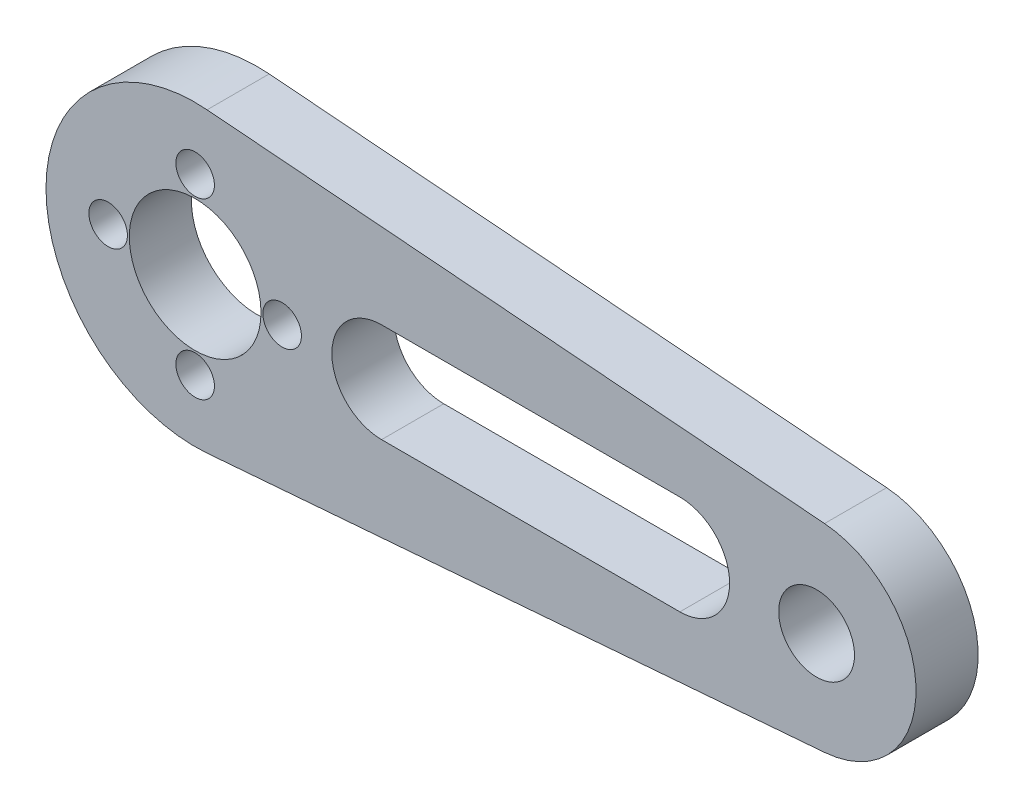
ISO-10303-21;
HEADER;
FILE_DESCRIPTION(('STEP AP214'),'2;1');
FILE_NAME('part.step','',(''),(''),'','','');
FILE_SCHEMA(('AUTOMOTIVE_DESIGN { 1 0 10303 214 1 1 1 1 }'));
ENDSEC;
DATA;
#1=APPLICATION_CONTEXT('core data for automotive mechanical design processes');
#2=APPLICATION_PROTOCOL_DEFINITION('international standard','automotive_design',2000,#1);
#3=PRODUCT_CONTEXT('',#1,'mechanical');
#4=PRODUCT('Part','Part','',(#3));
#5=PRODUCT_RELATED_PRODUCT_CATEGORY('part','',(#4));
#6=PRODUCT_DEFINITION_FORMATION('','',#4);
#7=PRODUCT_DEFINITION_CONTEXT('part definition',#1,'design');
#8=PRODUCT_DEFINITION('design','',#6,#7);
#9=PRODUCT_DEFINITION_SHAPE('','',#8);
#10=(LENGTH_UNIT() NAMED_UNIT(*) SI_UNIT(.MILLI.,.METRE.));
#11=(NAMED_UNIT(*) PLANE_ANGLE_UNIT() SI_UNIT($,.RADIAN.));
#12=(NAMED_UNIT(*) SI_UNIT($,.STERADIAN.) SOLID_ANGLE_UNIT());
#13=UNCERTAINTY_MEASURE_WITH_UNIT(LENGTH_MEASURE(1.E-05),#10,'distance_accuracy_value','');
#14=(GEOMETRIC_REPRESENTATION_CONTEXT(3) GLOBAL_UNCERTAINTY_ASSIGNED_CONTEXT((#13)) GLOBAL_UNIT_ASSIGNED_CONTEXT((#10,
#11,#12)) REPRESENTATION_CONTEXT('',''));
#15=CARTESIAN_POINT('',(0.,0.,0.));
#16=DIRECTION('',(0.,0.,1.));
#17=DIRECTION('',(1.,0.,0.));
#18=AXIS2_PLACEMENT_3D('',#15,#16,#17);
#19=CARTESIAN_POINT('',(0.,0.,5.));
#20=DIRECTION('',(0.,0.,1.));
#21=DIRECTION('',(1.,0.,0.));
#22=AXIS2_PLACEMENT_3D('',#19,#20,#21);
#23=PLANE('',#22);
#24=CARTESIAN_POINT('',(15.,0.,5.));
#25=DIRECTION('',(0.,0.,1.));
#26=DIRECTION('',(1.,0.,0.));
#27=AXIS2_PLACEMENT_3D('',#24,#25,#26);
#28=CIRCLE('',#27,4.);
#29=CARTESIAN_POINT('',(15.,4.,5.));
#30=VERTEX_POINT('',#29);
#31=CARTESIAN_POINT('',(15.,-4.,5.));
#32=VERTEX_POINT('',#31);
#33=EDGE_CURVE('E49',#30,#32,#28,.T.);
#34=ORIENTED_EDGE('',*,*,#33,.F.);
#35=DIRECTION('',(-1.,0.,0.));
#36=VECTOR('',#35,1.);
#37=CARTESIAN_POINT('',(15.,4.,5.));
#38=LINE('',#37,#36);
#39=CARTESIAN_POINT('',(39.,4.,5.));
#40=VERTEX_POINT('',#39);
#41=EDGE_CURVE('E117',#40,#30,#38,.T.);
#42=ORIENTED_EDGE('',*,*,#41,.F.);
#43=CARTESIAN_POINT('',(39.,0.,5.));
#44=DIRECTION('',(0.,0.,1.));
#45=DIRECTION('',(1.,0.,0.));
#46=AXIS2_PLACEMENT_3D('',#43,#44,#45);
#47=CIRCLE('',#46,4.);
#48=CARTESIAN_POINT('',(39.,-4.,5.));
#49=VERTEX_POINT('',#48);
#50=EDGE_CURVE('E102',#49,#40,#47,.T.);
#51=ORIENTED_EDGE('',*,*,#50,.F.);
#52=DIRECTION('',(1.,0.,0.));
#53=VECTOR('',#52,1.);
#54=CARTESIAN_POINT('',(15.,-4.,5.));
#55=LINE('',#54,#53);
#56=EDGE_CURVE('E111',#32,#49,#55,.T.);
#57=ORIENTED_EDGE('',*,*,#56,.F.);
#58=EDGE_LOOP('',(#34,#42,#51,#57));
#59=FACE_BOUND('',#58,.T.);
#60=CARTESIAN_POINT('',(0.,7.,5.));
#61=DIRECTION('',(0.,0.,1.));
#62=DIRECTION('',(1.,0.,0.));
#63=AXIS2_PLACEMENT_3D('',#60,#61,#62);
#64=CIRCLE('',#63,1.55);
#65=CARTESIAN_POINT('',(1.55,7.,5.));
#66=VERTEX_POINT('',#65);
#67=EDGE_CURVE('E133',#66,#66,#64,.T.);
#68=ORIENTED_EDGE('',*,*,#67,.F.);
#69=EDGE_LOOP('',(#68));
#70=FACE_BOUND('',#69,.T.);
#71=CARTESIAN_POINT('',(7.,0.,5.));
#72=DIRECTION('',(0.,0.,1.));
#73=DIRECTION('',(1.,0.,0.));
#74=AXIS2_PLACEMENT_3D('',#71,#72,#73);
#75=CIRCLE('',#74,1.55);
#76=CARTESIAN_POINT('',(8.55,0.,5.));
#77=VERTEX_POINT('',#76);
#78=EDGE_CURVE('E145',#77,#77,#75,.T.);
#79=ORIENTED_EDGE('',*,*,#78,.F.);
#80=EDGE_LOOP('',(#79));
#81=FACE_BOUND('',#80,.T.);
#82=CARTESIAN_POINT('',(0.,0.,5.));
#83=DIRECTION('',(0.,0.,1.));
#84=DIRECTION('',(1.,0.,0.));
#85=AXIS2_PLACEMENT_3D('',#82,#83,#84);
#86=CIRCLE('',#85,5.3);
#87=CARTESIAN_POINT('',(5.3,0.,5.));
#88=VERTEX_POINT('',#87);
#89=EDGE_CURVE('E157',#88,#88,#86,.T.);
#90=ORIENTED_EDGE('',*,*,#89,.F.);
#91=EDGE_LOOP('',(#90));
#92=FACE_BOUND('',#91,.T.);
#93=CARTESIAN_POINT('',(0.,0.,5.));
#94=DIRECTION('',(0.,0.,1.));
#95=DIRECTION('',(1.,0.,0.));
#96=AXIS2_PLACEMENT_3D('',#93,#94,#95);
#97=CIRCLE('',#96,12.);
#98=CARTESIAN_POINT('',(0.959999999999999,11.961538362602,5.));
#99=VERTEX_POINT('',#98);
#100=CARTESIAN_POINT('',(0.96,-11.961538362602,5.));
#101=VERTEX_POINT('',#100);
#102=EDGE_CURVE('E163',#99,#101,#97,.T.);
#103=ORIENTED_EDGE('',*,*,#102,.T.);
#104=DIRECTION('',(0.996794863550169,0.0800000000000001,0.));
#105=VECTOR('',#104,1.);
#106=CARTESIAN_POINT('',(50.64,-7.97435890840135,5.));
#107=LINE('',#106,#105);
#108=CARTESIAN_POINT('',(50.64,-7.97435890840135,5.));
#109=VERTEX_POINT('',#108);
#110=EDGE_CURVE('E166',#101,#109,#107,.T.);
#111=ORIENTED_EDGE('',*,*,#110,.T.);
#112=CARTESIAN_POINT('',(50.,0.,5.));
#113=DIRECTION('',(0.,0.,1.));
#114=DIRECTION('',(1.,0.,0.));
#115=AXIS2_PLACEMENT_3D('',#112,#113,#114);
#116=CIRCLE('',#115,8.);
#117=CARTESIAN_POINT('',(50.64,7.97435890840135,5.));
#118=VERTEX_POINT('',#117);
#119=EDGE_CURVE('E169',#109,#118,#116,.T.);
#120=ORIENTED_EDGE('',*,*,#119,.T.);
#121=DIRECTION('',(-0.996794863550169,0.0799999999999999,0.));
#122=VECTOR('',#121,1.);
#123=CARTESIAN_POINT('',(0.959999999999999,11.961538362602,5.));
#124=LINE('',#123,#122);
#125=EDGE_CURVE('E171',#118,#99,#124,.T.);
#126=ORIENTED_EDGE('',*,*,#125,.T.);
#127=EDGE_LOOP('',(#103,#111,#120,#126));
#128=FACE_BOUND('',#127,.T.);
#129=CARTESIAN_POINT('',(50.,0.,5.));
#130=DIRECTION('',(0.,0.,1.));
#131=DIRECTION('',(1.,0.,0.));
#132=AXIS2_PLACEMENT_3D('',#129,#130,#131);
#133=CIRCLE('',#132,3.05);
#134=CARTESIAN_POINT('',(53.05,0.,5.));
#135=VERTEX_POINT('',#134);
#136=EDGE_CURVE('E151',#135,#135,#133,.T.);
#137=ORIENTED_EDGE('',*,*,#136,.F.);
#138=EDGE_LOOP('',(#137));
#139=FACE_BOUND('',#138,.T.);
#140=CARTESIAN_POINT('',(-7.,0.,5.));
#141=DIRECTION('',(0.,0.,1.));
#142=DIRECTION('',(1.,0.,0.));
#143=AXIS2_PLACEMENT_3D('',#140,#141,#142);
#144=CIRCLE('',#143,1.55);
#145=CARTESIAN_POINT('',(-5.45,0.,5.));
#146=VERTEX_POINT('',#145);
#147=EDGE_CURVE('E139',#146,#146,#144,.T.);
#148=ORIENTED_EDGE('',*,*,#147,.F.);
#149=EDGE_LOOP('',(#148));
#150=FACE_BOUND('',#149,.T.);
#151=CARTESIAN_POINT('',(0.,-7.,5.));
#152=DIRECTION('',(0.,0.,1.));
#153=DIRECTION('',(1.,0.,0.));
#154=AXIS2_PLACEMENT_3D('',#151,#152,#153);
#155=CIRCLE('',#154,1.55);
#156=CARTESIAN_POINT('',(1.55,-7.,5.));
#157=VERTEX_POINT('',#156);
#158=EDGE_CURVE('E127',#157,#157,#155,.T.);
#159=ORIENTED_EDGE('',*,*,#158,.F.);
#160=EDGE_LOOP('',(#159));
#161=FACE_BOUND('',#160,.T.);
#162=ADVANCED_FACE('F34',(#59,#70,#81,#92,#128,#139,#150,#161),#23,.T.);
#163=CARTESIAN_POINT('',(0.,0.,0.));
#164=DIRECTION('',(0.,0.,1.));
#165=DIRECTION('',(1.,0.,0.));
#166=AXIS2_PLACEMENT_3D('',#163,#164,#165);
#167=PLANE('',#166);
#168=DIRECTION('',(-1.,0.,0.));
#169=VECTOR('',#168,1.);
#170=CARTESIAN_POINT('',(0.,4.,0.));
#171=LINE('',#170,#169);
#172=CARTESIAN_POINT('',(39.,4.,0.));
#173=VERTEX_POINT('',#172);
#174=CARTESIAN_POINT('',(15.,4.,0.));
#175=VERTEX_POINT('',#174);
#176=EDGE_CURVE('E42',#173,#175,#171,.T.);
#177=ORIENTED_EDGE('',*,*,#176,.T.);
#178=CARTESIAN_POINT('',(15.,0.,0.));
#179=DIRECTION('',(0.,0.,1.));
#180=DIRECTION('',(1.,0.,0.));
#181=AXIS2_PLACEMENT_3D('',#178,#179,#180);
#182=CIRCLE('',#181,4.);
#183=CARTESIAN_POINT('',(15.,-4.,0.));
#184=VERTEX_POINT('',#183);
#185=EDGE_CURVE('E11',#175,#184,#182,.T.);
#186=ORIENTED_EDGE('',*,*,#185,.T.);
#187=DIRECTION('',(1.,0.,0.));
#188=VECTOR('',#187,1.);
#189=CARTESIAN_POINT('',(0.,-4.,0.));
#190=LINE('',#189,#188);
#191=CARTESIAN_POINT('',(39.,-4.,0.));
#192=VERTEX_POINT('',#191);
#193=EDGE_CURVE('E192',#184,#192,#190,.T.);
#194=ORIENTED_EDGE('',*,*,#193,.T.);
#195=CARTESIAN_POINT('',(39.,0.,0.));
#196=DIRECTION('',(0.,0.,1.));
#197=DIRECTION('',(1.,0.,0.));
#198=AXIS2_PLACEMENT_3D('',#195,#196,#197);
#199=CIRCLE('',#198,4.);
#200=EDGE_CURVE('E105',#192,#173,#199,.T.);
#201=ORIENTED_EDGE('',*,*,#200,.T.);
#202=EDGE_LOOP('',(#177,#186,#194,#201));
#203=FACE_BOUND('',#202,.T.);
#204=CARTESIAN_POINT('',(0.,0.,0.));
#205=DIRECTION('',(0.,0.,1.));
#206=DIRECTION('',(1.,0.,0.));
#207=AXIS2_PLACEMENT_3D('',#204,#205,#206);
#208=CIRCLE('',#207,12.);
#209=CARTESIAN_POINT('',(0.959999999999999,11.961538362602,0.));
#210=VERTEX_POINT('',#209);
#211=CARTESIAN_POINT('',(0.96,-11.961538362602,0.));
#212=VERTEX_POINT('',#211);
#213=EDGE_CURVE('E160',#210,#212,#208,.T.);
#214=ORIENTED_EDGE('',*,*,#213,.F.);
#215=DIRECTION('',(-0.996794863550169,0.0799999999999999,0.));
#216=VECTOR('',#215,1.);
#217=CARTESIAN_POINT('',(0.959999999999999,11.961538362602,0.));
#218=LINE('',#217,#216);
#219=CARTESIAN_POINT('',(50.64,7.97435890840135,0.));
#220=VERTEX_POINT('',#219);
#221=EDGE_CURVE('E167',#220,#210,#218,.T.);
#222=ORIENTED_EDGE('',*,*,#221,.F.);
#223=CARTESIAN_POINT('',(50.,0.,0.));
#224=DIRECTION('',(0.,0.,1.));
#225=DIRECTION('',(1.,0.,0.));
#226=AXIS2_PLACEMENT_3D('',#223,#224,#225);
#227=CIRCLE('',#226,8.);
#228=CARTESIAN_POINT('',(50.64,-7.97435890840135,0.));
#229=VERTEX_POINT('',#228);
#230=EDGE_CURVE('E178',#229,#220,#227,.T.);
#231=ORIENTED_EDGE('',*,*,#230,.F.);
#232=DIRECTION('',(0.996794863550169,0.0800000000000001,0.));
#233=VECTOR('',#232,1.);
#234=CARTESIAN_POINT('',(50.64,-7.97435890840135,0.));
#235=LINE('',#234,#233);
#236=EDGE_CURVE('E176',#212,#229,#235,.T.);
#237=ORIENTED_EDGE('',*,*,#236,.F.);
#238=EDGE_LOOP('',(#214,#222,#231,#237));
#239=FACE_BOUND('',#238,.T.);
#240=CARTESIAN_POINT('',(0.,0.,0.));
#241=DIRECTION('',(0.,0.,1.));
#242=DIRECTION('',(1.,0.,0.));
#243=AXIS2_PLACEMENT_3D('',#240,#241,#242);
#244=CIRCLE('',#243,5.3);
#245=CARTESIAN_POINT('',(5.3,0.,0.));
#246=VERTEX_POINT('',#245);
#247=EDGE_CURVE('E154',#246,#246,#244,.T.);
#248=ORIENTED_EDGE('',*,*,#247,.T.);
#249=EDGE_LOOP('',(#248));
#250=FACE_BOUND('',#249,.T.);
#251=CARTESIAN_POINT('',(50.,0.,0.));
#252=DIRECTION('',(0.,0.,1.));
#253=DIRECTION('',(1.,0.,0.));
#254=AXIS2_PLACEMENT_3D('',#251,#252,#253);
#255=CIRCLE('',#254,3.05);
#256=CARTESIAN_POINT('',(53.05,0.,0.));
#257=VERTEX_POINT('',#256);
#258=EDGE_CURVE('E148',#257,#257,#255,.T.);
#259=ORIENTED_EDGE('',*,*,#258,.T.);
#260=EDGE_LOOP('',(#259));
#261=FACE_BOUND('',#260,.T.);
#262=CARTESIAN_POINT('',(7.,0.,0.));
#263=DIRECTION('',(0.,0.,1.));
#264=DIRECTION('',(1.,0.,0.));
#265=AXIS2_PLACEMENT_3D('',#262,#263,#264);
#266=CIRCLE('',#265,1.55);
#267=CARTESIAN_POINT('',(8.55,0.,0.));
#268=VERTEX_POINT('',#267);
#269=EDGE_CURVE('E142',#268,#268,#266,.T.);
#270=ORIENTED_EDGE('',*,*,#269,.T.);
#271=EDGE_LOOP('',(#270));
#272=FACE_BOUND('',#271,.T.);
#273=CARTESIAN_POINT('',(-7.,0.,0.));
#274=DIRECTION('',(0.,0.,1.));
#275=DIRECTION('',(1.,0.,0.));
#276=AXIS2_PLACEMENT_3D('',#273,#274,#275);
#277=CIRCLE('',#276,1.55);
#278=CARTESIAN_POINT('',(-5.45,0.,0.));
#279=VERTEX_POINT('',#278);
#280=EDGE_CURVE('E136',#279,#279,#277,.T.);
#281=ORIENTED_EDGE('',*,*,#280,.T.);
#282=EDGE_LOOP('',(#281));
#283=FACE_BOUND('',#282,.T.);
#284=CARTESIAN_POINT('',(0.,7.,0.));
#285=DIRECTION('',(0.,0.,1.));
#286=DIRECTION('',(1.,0.,0.));
#287=AXIS2_PLACEMENT_3D('',#284,#285,#286);
#288=CIRCLE('',#287,1.55);
#289=CARTESIAN_POINT('',(1.55,7.,0.));
#290=VERTEX_POINT('',#289);
#291=EDGE_CURVE('E130',#290,#290,#288,.T.);
#292=ORIENTED_EDGE('',*,*,#291,.T.);
#293=EDGE_LOOP('',(#292));
#294=FACE_BOUND('',#293,.T.);
#295=CARTESIAN_POINT('',(0.,-7.,0.));
#296=DIRECTION('',(0.,0.,1.));
#297=DIRECTION('',(1.,0.,0.));
#298=AXIS2_PLACEMENT_3D('',#295,#296,#297);
#299=CIRCLE('',#298,1.55);
#300=CARTESIAN_POINT('',(1.55,-7.,0.));
#301=VERTEX_POINT('',#300);
#302=EDGE_CURVE('E124',#301,#301,#299,.T.);
#303=ORIENTED_EDGE('',*,*,#302,.T.);
#304=EDGE_LOOP('',(#303));
#305=FACE_BOUND('',#304,.T.);
#306=ADVANCED_FACE('F196',(#203,#239,#250,#261,#272,#283,#294,#305),#167,.F.);
#307=CARTESIAN_POINT('',(0.,0.,5.));
#308=DIRECTION('',(0.,0.,-1.));
#309=DIRECTION('',(-1.,0.,0.));
#310=AXIS2_PLACEMENT_3D('',#307,#308,#309);
#311=CYLINDRICAL_SURFACE('',#310,12.);
#312=ORIENTED_EDGE('',*,*,#213,.T.);
#313=DIRECTION('',(0.,0.,-1.));
#314=VECTOR('',#313,1.);
#315=CARTESIAN_POINT('',(0.96,-11.961538362602,5.));
#316=LINE('',#315,#314);
#317=EDGE_CURVE('E189',#101,#212,#316,.T.);
#318=ORIENTED_EDGE('',*,*,#317,.F.);
#319=ORIENTED_EDGE('',*,*,#102,.F.);
#320=DIRECTION('',(0.,0.,-1.));
#321=VECTOR('',#320,1.);
#322=CARTESIAN_POINT('',(0.959999999999999,11.961538362602,5.));
#323=LINE('',#322,#321);
#324=EDGE_CURVE('E173',#99,#210,#323,.T.);
#325=ORIENTED_EDGE('',*,*,#324,.T.);
#326=EDGE_LOOP('',(#312,#318,#319,#325));
#327=FACE_BOUND('',#326,.T.);
#328=ADVANCED_FACE('F36',(#327),#311,.T.);
#329=CARTESIAN_POINT('',(50.64,-7.97435890840135,5.));
#330=DIRECTION('',(-0.0800000000000001,0.996794863550169,0.));
#331=DIRECTION('',(-0.996794863550169,-0.0800000000000001,0.));
#332=AXIS2_PLACEMENT_3D('',#329,#330,#331);
#333=PLANE('',#332);
#334=ORIENTED_EDGE('',*,*,#236,.T.);
#335=DIRECTION('',(0.,0.,-1.));
#336=VECTOR('',#335,1.);
#337=CARTESIAN_POINT('',(50.64,-7.97435890840135,5.));
#338=LINE('',#337,#336);
#339=EDGE_CURVE('E186',#109,#229,#338,.T.);
#340=ORIENTED_EDGE('',*,*,#339,.F.);
#341=ORIENTED_EDGE('',*,*,#110,.F.);
#342=ORIENTED_EDGE('',*,*,#317,.T.);
#343=EDGE_LOOP('',(#334,#340,#341,#342));
#344=FACE_BOUND('',#343,.T.);
#345=ADVANCED_FACE('F230',(#344),#333,.F.);
#346=CARTESIAN_POINT('',(50.,0.,5.));
#347=DIRECTION('',(0.,0.,-1.));
#348=DIRECTION('',(-1.,0.,0.));
#349=AXIS2_PLACEMENT_3D('',#346,#347,#348);
#350=CYLINDRICAL_SURFACE('',#349,8.);
#351=ORIENTED_EDGE('',*,*,#230,.T.);
#352=DIRECTION('',(0.,0.,-1.));
#353=VECTOR('',#352,1.);
#354=CARTESIAN_POINT('',(50.64,7.97435890840135,5.));
#355=LINE('',#354,#353);
#356=EDGE_CURVE('E183',#118,#220,#355,.T.);
#357=ORIENTED_EDGE('',*,*,#356,.F.);
#358=ORIENTED_EDGE('',*,*,#119,.F.);
#359=ORIENTED_EDGE('',*,*,#339,.T.);
#360=EDGE_LOOP('',(#351,#357,#358,#359));
#361=FACE_BOUND('',#360,.T.);
#362=ADVANCED_FACE('F227',(#361),#350,.T.);
#363=CARTESIAN_POINT('',(0.959999999999999,11.961538362602,5.));
#364=DIRECTION('',(-0.0799999999999999,-0.996794863550169,0.));
#365=DIRECTION('',(0.996794863550169,-0.0799999999999999,0.));
#366=AXIS2_PLACEMENT_3D('',#363,#364,#365);
#367=PLANE('',#366);
#368=ORIENTED_EDGE('',*,*,#221,.T.);
#369=ORIENTED_EDGE('',*,*,#324,.F.);
#370=ORIENTED_EDGE('',*,*,#125,.F.);
#371=ORIENTED_EDGE('',*,*,#356,.T.);
#372=EDGE_LOOP('',(#368,#369,#370,#371));
#373=FACE_BOUND('',#372,.T.);
#374=ADVANCED_FACE('F224',(#373),#367,.F.);
#375=CARTESIAN_POINT('',(0.,0.,5.));
#376=DIRECTION('',(0.,0.,-1.));
#377=DIRECTION('',(-1.,0.,0.));
#378=AXIS2_PLACEMENT_3D('',#375,#376,#377);
#379=CYLINDRICAL_SURFACE('',#378,5.3);
#380=ORIENTED_EDGE('',*,*,#89,.T.);
#381=EDGE_LOOP('',(#380));
#382=FACE_BOUND('',#381,.T.);
#383=ORIENTED_EDGE('',*,*,#247,.F.);
#384=EDGE_LOOP('',(#383));
#385=FACE_BOUND('',#384,.T.);
#386=ADVANCED_FACE('F221',(#382,#385),#379,.F.);
#387=CARTESIAN_POINT('',(50.,0.,5.));
#388=DIRECTION('',(0.,0.,-1.));
#389=DIRECTION('',(-1.,0.,0.));
#390=AXIS2_PLACEMENT_3D('',#387,#388,#389);
#391=CYLINDRICAL_SURFACE('',#390,3.05);
#392=ORIENTED_EDGE('',*,*,#136,.T.);
#393=EDGE_LOOP('',(#392));
#394=FACE_BOUND('',#393,.T.);
#395=ORIENTED_EDGE('',*,*,#258,.F.);
#396=EDGE_LOOP('',(#395));
#397=FACE_BOUND('',#396,.T.);
#398=ADVANCED_FACE('F277',(#394,#397),#391,.F.);
#399=CARTESIAN_POINT('',(7.,0.,5.));
#400=DIRECTION('',(0.,0.,-1.));
#401=DIRECTION('',(-1.,0.,0.));
#402=AXIS2_PLACEMENT_3D('',#399,#400,#401);
#403=CYLINDRICAL_SURFACE('',#402,1.55);
#404=ORIENTED_EDGE('',*,*,#78,.T.);
#405=EDGE_LOOP('',(#404));
#406=FACE_BOUND('',#405,.T.);
#407=ORIENTED_EDGE('',*,*,#269,.F.);
#408=EDGE_LOOP('',(#407));
#409=FACE_BOUND('',#408,.T.);
#410=ADVANCED_FACE('F263',(#406,#409),#403,.F.);
#411=CARTESIAN_POINT('',(-7.,0.,5.));
#412=DIRECTION('',(0.,0.,-1.));
#413=DIRECTION('',(-1.,0.,0.));
#414=AXIS2_PLACEMENT_3D('',#411,#412,#413);
#415=CYLINDRICAL_SURFACE('',#414,1.55);
#416=ORIENTED_EDGE('',*,*,#147,.T.);
#417=EDGE_LOOP('',(#416));
#418=FACE_BOUND('',#417,.T.);
#419=ORIENTED_EDGE('',*,*,#280,.F.);
#420=EDGE_LOOP('',(#419));
#421=FACE_BOUND('',#420,.T.);
#422=ADVANCED_FACE('F260',(#418,#421),#415,.F.);
#423=CARTESIAN_POINT('',(0.,7.,5.));
#424=DIRECTION('',(0.,0.,-1.));
#425=DIRECTION('',(-1.,0.,0.));
#426=AXIS2_PLACEMENT_3D('',#423,#424,#425);
#427=CYLINDRICAL_SURFACE('',#426,1.55);
#428=ORIENTED_EDGE('',*,*,#67,.T.);
#429=EDGE_LOOP('',(#428));
#430=FACE_BOUND('',#429,.T.);
#431=ORIENTED_EDGE('',*,*,#291,.F.);
#432=EDGE_LOOP('',(#431));
#433=FACE_BOUND('',#432,.T.);
#434=ADVANCED_FACE('F210',(#430,#433),#427,.F.);
#435=CARTESIAN_POINT('',(0.,-7.,5.));
#436=DIRECTION('',(0.,0.,-1.));
#437=DIRECTION('',(-1.,0.,0.));
#438=AXIS2_PLACEMENT_3D('',#435,#436,#437);
#439=CYLINDRICAL_SURFACE('',#438,1.55);
#440=ORIENTED_EDGE('',*,*,#158,.T.);
#441=EDGE_LOOP('',(#440));
#442=FACE_BOUND('',#441,.T.);
#443=ORIENTED_EDGE('',*,*,#302,.F.);
#444=EDGE_LOOP('',(#443));
#445=FACE_BOUND('',#444,.T.);
#446=ADVANCED_FACE('F203',(#442,#445),#439,.F.);
#447=CARTESIAN_POINT('',(15.,0.,-5.));
#448=DIRECTION('',(0.,0.,1.));
#449=DIRECTION('',(1.,0.,0.));
#450=AXIS2_PLACEMENT_3D('',#447,#448,#449);
#451=CYLINDRICAL_SURFACE('',#450,4.);
#452=DIRECTION('',(0.,0.,1.));
#453=VECTOR('',#452,1.);
#454=CARTESIAN_POINT('',(15.,4.,-5.));
#455=LINE('',#454,#453);
#456=EDGE_CURVE('E122',#175,#30,#455,.T.);
#457=ORIENTED_EDGE('',*,*,#456,.T.);
#458=ORIENTED_EDGE('',*,*,#33,.T.);
#459=DIRECTION('',(0.,0.,1.));
#460=VECTOR('',#459,1.);
#461=CARTESIAN_POINT('',(15.,-4.,-5.));
#462=LINE('',#461,#460);
#463=EDGE_CURVE('E108',#184,#32,#462,.T.);
#464=ORIENTED_EDGE('',*,*,#463,.F.);
#465=ORIENTED_EDGE('',*,*,#185,.F.);
#466=EDGE_LOOP('',(#457,#458,#464,#465));
#467=FACE_BOUND('',#466,.T.);
#468=ADVANCED_FACE('F201',(#467),#451,.F.);
#469=CARTESIAN_POINT('',(15.,4.,-5.));
#470=DIRECTION('',(0.,1.,0.));
#471=DIRECTION('',(-1.,0.,0.));
#472=AXIS2_PLACEMENT_3D('',#469,#470,#471);
#473=PLANE('',#472);
#474=DIRECTION('',(0.,0.,1.));
#475=VECTOR('',#474,1.);
#476=CARTESIAN_POINT('',(39.,4.,-5.));
#477=LINE('',#476,#475);
#478=EDGE_CURVE('E107',#173,#40,#477,.T.);
#479=ORIENTED_EDGE('',*,*,#478,.T.);
#480=ORIENTED_EDGE('',*,*,#41,.T.);
#481=ORIENTED_EDGE('',*,*,#456,.F.);
#482=ORIENTED_EDGE('',*,*,#176,.F.);
#483=EDGE_LOOP('',(#479,#480,#481,#482));
#484=FACE_BOUND('',#483,.T.);
#485=ADVANCED_FACE('F200',(#484),#473,.F.);
#486=CARTESIAN_POINT('',(39.,0.,-5.));
#487=DIRECTION('',(0.,0.,1.));
#488=DIRECTION('',(1.,0.,0.));
#489=AXIS2_PLACEMENT_3D('',#486,#487,#488);
#490=CYLINDRICAL_SURFACE('',#489,4.);
#491=DIRECTION('',(0.,0.,1.));
#492=VECTOR('',#491,1.);
#493=CARTESIAN_POINT('',(39.,-4.,-5.));
#494=LINE('',#493,#492);
#495=EDGE_CURVE('E57',#192,#49,#494,.T.);
#496=ORIENTED_EDGE('',*,*,#495,.T.);
#497=ORIENTED_EDGE('',*,*,#50,.T.);
#498=ORIENTED_EDGE('',*,*,#478,.F.);
#499=ORIENTED_EDGE('',*,*,#200,.F.);
#500=EDGE_LOOP('',(#496,#497,#498,#499));
#501=FACE_BOUND('',#500,.T.);
#502=ADVANCED_FACE('F99',(#501),#490,.F.);
#503=CARTESIAN_POINT('',(15.,-4.,-5.));
#504=DIRECTION('',(0.,-1.,0.));
#505=DIRECTION('',(1.,0.,0.));
#506=AXIS2_PLACEMENT_3D('',#503,#504,#505);
#507=PLANE('',#506);
#508=ORIENTED_EDGE('',*,*,#463,.T.);
#509=ORIENTED_EDGE('',*,*,#56,.T.);
#510=ORIENTED_EDGE('',*,*,#495,.F.);
#511=ORIENTED_EDGE('',*,*,#193,.F.);
#512=EDGE_LOOP('',(#508,#509,#510,#511));
#513=FACE_BOUND('',#512,.T.);
#514=ADVANCED_FACE('F112',(#513),#507,.F.);
#515=CLOSED_SHELL('',(#162,#306,#328,#345,#362,#374,#386,#398,#410,#422,#434,#446,#468,#485,
#502,#514));
#516=MANIFOLD_SOLID_BREP('B2',#515);
#517=ADVANCED_BREP_SHAPE_REPRESENTATION('',(#18,#516),#14);
#518=SHAPE_DEFINITION_REPRESENTATION(#9,#517);
ENDSEC;
END-ISO-10303-21;
